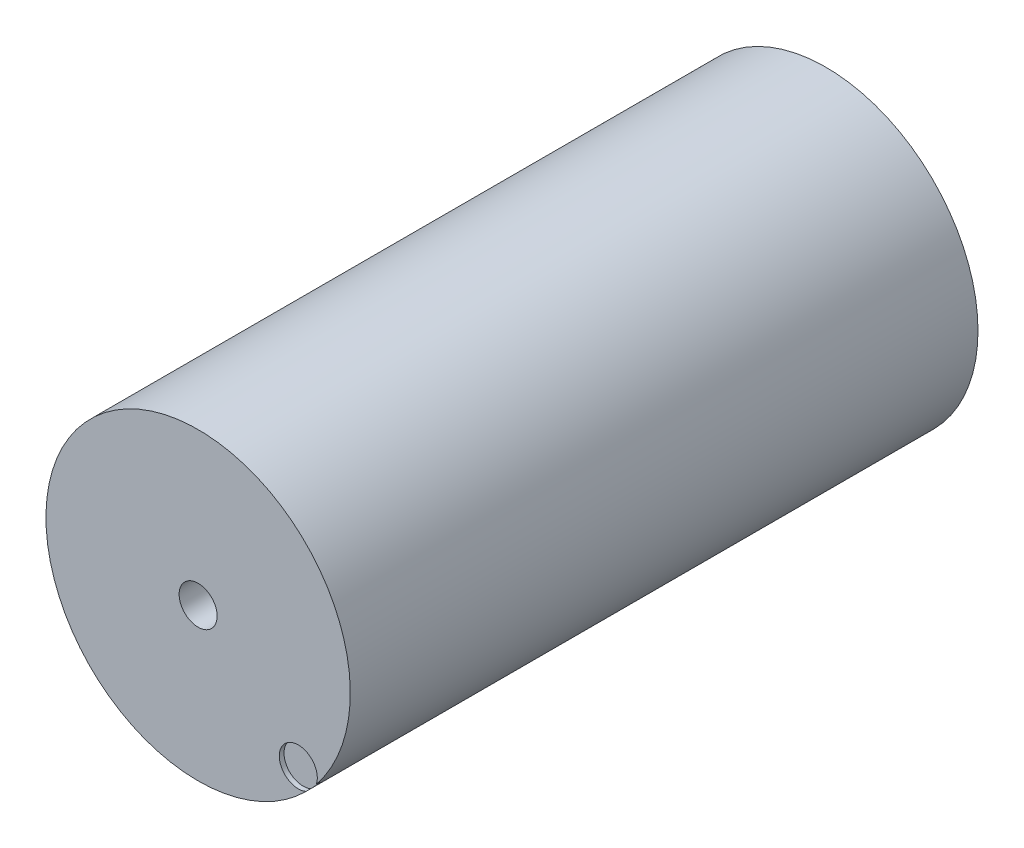
ISO-10303-21;
HEADER;
FILE_DESCRIPTION(('STEP AP214'),'2;1');
FILE_NAME('part.step','',(''),(''),'','','');
FILE_SCHEMA(('AUTOMOTIVE_DESIGN { 1 0 10303 214 1 1 1 1 }'));
ENDSEC;
DATA;
#1=APPLICATION_CONTEXT('core data for automotive mechanical design processes');
#2=APPLICATION_PROTOCOL_DEFINITION('international standard','automotive_design',2000,#1);
#3=PRODUCT_CONTEXT('',#1,'mechanical');
#4=PRODUCT('Part','Part','',(#3));
#5=PRODUCT_RELATED_PRODUCT_CATEGORY('part','',(#4));
#6=PRODUCT_DEFINITION_FORMATION('','',#4);
#7=PRODUCT_DEFINITION_CONTEXT('part definition',#1,'design');
#8=PRODUCT_DEFINITION('design','',#6,#7);
#9=PRODUCT_DEFINITION_SHAPE('','',#8);
#10=(LENGTH_UNIT() NAMED_UNIT(*) SI_UNIT(.MILLI.,.METRE.));
#11=(NAMED_UNIT(*) PLANE_ANGLE_UNIT() SI_UNIT($,.RADIAN.));
#12=(NAMED_UNIT(*) SI_UNIT($,.STERADIAN.) SOLID_ANGLE_UNIT());
#13=UNCERTAINTY_MEASURE_WITH_UNIT(LENGTH_MEASURE(1.E-05),#10,'distance_accuracy_value','');
#14=(GEOMETRIC_REPRESENTATION_CONTEXT(3) GLOBAL_UNCERTAINTY_ASSIGNED_CONTEXT((#13)) GLOBAL_UNIT_ASSIGNED_CONTEXT((#10,
#11,#12)) REPRESENTATION_CONTEXT('',''));
#15=CARTESIAN_POINT('',(0.,0.,0.));
#16=DIRECTION('',(0.,0.,1.));
#17=DIRECTION('',(1.,0.,0.));
#18=AXIS2_PLACEMENT_3D('',#15,#16,#17);
#19=CARTESIAN_POINT('',(0.,0.,0.));
#20=DIRECTION('',(0.,0.,1.));
#21=DIRECTION('',(1.,0.,0.));
#22=AXIS2_PLACEMENT_3D('',#19,#20,#21);
#23=PLANE('',#22);
#24=CARTESIAN_POINT('',(0.,0.,0.));
#25=DIRECTION('',(0.,0.,1.));
#26=DIRECTION('',(1.,0.,0.));
#27=AXIS2_PLACEMENT_3D('',#24,#25,#26);
#28=CIRCLE('',#27,1.99999999999998);
#29=CARTESIAN_POINT('',(1.99999999999998,0.,0.));
#30=VERTEX_POINT('',#29);
#31=EDGE_CURVE('E82',#30,#30,#28,.T.);
#32=ORIENTED_EDGE('',*,*,#31,.T.);
#33=EDGE_LOOP('',(#32));
#34=FACE_BOUND('',#33,.T.);
#35=CARTESIAN_POINT('',(0.,0.,0.));
#36=DIRECTION('',(0.,0.,1.));
#37=DIRECTION('',(1.,0.,0.));
#38=AXIS2_PLACEMENT_3D('',#35,#36,#37);
#39=CIRCLE('',#38,16.);
#40=CARTESIAN_POINT('',(16.,0.,0.));
#41=VERTEX_POINT('',#40);
#42=EDGE_CURVE('E91',#41,#41,#39,.T.);
#43=ORIENTED_EDGE('',*,*,#42,.F.);
#44=EDGE_LOOP('',(#43));
#45=FACE_BOUND('',#44,.T.);
#46=ADVANCED_FACE('F53',(#34,#45),#23,.F.);
#47=CARTESIAN_POINT('',(0.,0.,66.));
#48=DIRECTION('',(0.,0.,1.));
#49=DIRECTION('',(1.,0.,0.));
#50=AXIS2_PLACEMENT_3D('',#47,#48,#49);
#51=PLANE('',#50);
#52=CARTESIAN_POINT('',(0.,0.,66.));
#53=DIRECTION('',(0.,0.,1.));
#54=DIRECTION('',(1.,0.,0.));
#55=AXIS2_PLACEMENT_3D('',#52,#53,#54);
#56=CIRCLE('',#55,1.99999999999999);
#57=CARTESIAN_POINT('',(1.99999999999999,0.,66.));
#58=VERTEX_POINT('',#57);
#59=EDGE_CURVE('E206',#58,#58,#56,.T.);
#60=ORIENTED_EDGE('',*,*,#59,.F.);
#61=EDGE_LOOP('',(#60));
#62=FACE_BOUND('',#61,.T.);
#63=CARTESIAN_POINT('',(10.5321145046291,-9.45328245563246,66.));
#64=DIRECTION('',(0.,0.,1.));
#65=DIRECTION('',(1.,0.,0.));
#66=AXIS2_PLACEMENT_3D('',#63,#64,#65);
#67=CIRCLE('',#66,1.99999999999999);
#68=CARTESIAN_POINT('',(12.435338152409,-10.0678878139976,66.));
#69=VERTEX_POINT('',#68);
#70=CARTESIAN_POINT('',(11.3480272997679,-11.2792852789404,66.));
#71=VERTEX_POINT('',#70);
#72=EDGE_CURVE('E75',#69,#71,#67,.T.);
#73=ORIENTED_EDGE('',*,*,#72,.F.);
#74=CARTESIAN_POINT('',(0.,0.,66.));
#75=DIRECTION('',(0.,0.,1.));
#76=DIRECTION('',(1.,0.,0.));
#77=AXIS2_PLACEMENT_3D('',#74,#75,#76);
#78=CIRCLE('',#77,16.);
#79=EDGE_CURVE('E88',#69,#71,#78,.T.);
#80=ORIENTED_EDGE('',*,*,#79,.T.);
#81=EDGE_LOOP('',(#73,#80));
#82=FACE_BOUND('',#81,.T.);
#83=ADVANCED_FACE('F89',(#62,#82),#51,.T.);
#84=CARTESIAN_POINT('',(0.,0.,66.));
#85=DIRECTION('',(0.,0.,-1.));
#86=DIRECTION('',(-1.,0.,0.));
#87=AXIS2_PLACEMENT_3D('',#84,#85,#86);
#88=CYLINDRICAL_SURFACE('',#87,16.);
#89=DIRECTION('',(0.,0.,1.));
#90=VECTOR('',#89,1.);
#91=CARTESIAN_POINT('',(11.348027299768,-11.2792852789404,65.75));
#92=LINE('',#91,#90);
#93=CARTESIAN_POINT('',(11.348027299768,-11.2792852789404,65.5));
#94=VERTEX_POINT('',#93);
#95=EDGE_CURVE('E12',#71,#94,#92,.F.);
#96=ORIENTED_EDGE('',*,*,#95,.F.);
#97=ORIENTED_EDGE('',*,*,#79,.F.);
#98=DIRECTION('',(0.,0.,1.));
#99=VECTOR('',#98,1.);
#100=CARTESIAN_POINT('',(12.435338152409,-10.0678878139976,65.75));
#101=LINE('',#100,#99);
#102=CARTESIAN_POINT('',(12.435338152409,-10.0678878139976,65.5));
#103=VERTEX_POINT('',#102);
#104=EDGE_CURVE('E78',#103,#69,#101,.T.);
#105=ORIENTED_EDGE('',*,*,#104,.F.);
#106=CARTESIAN_POINT('',(0.,0.,65.5));
#107=DIRECTION('',(0.,0.,-1.));
#108=DIRECTION('',(-1.,0.,0.));
#109=AXIS2_PLACEMENT_3D('',#106,#107,#108);
#110=CIRCLE('',#109,16.);
#111=EDGE_CURVE('E60',#94,#103,#110,.F.);
#112=ORIENTED_EDGE('',*,*,#111,.F.);
#113=EDGE_LOOP('',(#96,#97,#105,#112));
#114=FACE_BOUND('',#113,.T.);
#115=ORIENTED_EDGE('',*,*,#42,.T.);
#116=EDGE_LOOP('',(#115));
#117=FACE_BOUND('',#116,.T.);
#118=ADVANCED_FACE('F86',(#114,#117),#88,.T.);
#119=CARTESIAN_POINT('',(10.5321145046291,-9.45328245563246,65.5));
#120=DIRECTION('',(0.,0.,-1.));
#121=DIRECTION('',(-1.,0.,0.));
#122=AXIS2_PLACEMENT_3D('',#119,#120,#121);
#123=PLANE('',#122);
#124=ORIENTED_EDGE('',*,*,#111,.T.);
#125=CARTESIAN_POINT('',(10.5321145046291,-9.45328245563246,65.5));
#126=DIRECTION('',(0.,0.,1.));
#127=DIRECTION('',(1.,0.,0.));
#128=AXIS2_PLACEMENT_3D('',#125,#126,#127);
#129=CIRCLE('',#128,1.99999999999999);
#130=EDGE_CURVE('E66',#103,#94,#129,.T.);
#131=ORIENTED_EDGE('',*,*,#130,.T.);
#132=EDGE_LOOP('',(#124,#131));
#133=FACE_BOUND('',#132,.T.);
#134=ADVANCED_FACE('F185',(#133),#123,.F.);
#135=CARTESIAN_POINT('',(10.5321145046291,-9.45328245563246,66.));
#136=DIRECTION('',(0.,0.,1.));
#137=DIRECTION('',(1.,0.,0.));
#138=AXIS2_PLACEMENT_3D('',#135,#136,#137);
#139=CYLINDRICAL_SURFACE('',#138,1.99999999999999);
#140=ORIENTED_EDGE('',*,*,#95,.T.);
#141=ORIENTED_EDGE('',*,*,#130,.F.);
#142=ORIENTED_EDGE('',*,*,#104,.T.);
#143=ORIENTED_EDGE('',*,*,#72,.T.);
#144=EDGE_LOOP('',(#140,#141,#142,#143));
#145=FACE_BOUND('',#144,.T.);
#146=ADVANCED_FACE('F76',(#145),#139,.F.);
#147=CARTESIAN_POINT('',(0.,0.,66.));
#148=DIRECTION('',(0.,0.,1.));
#149=DIRECTION('',(1.,0.,0.));
#150=AXIS2_PLACEMENT_3D('',#147,#148,#149);
#151=CYLINDRICAL_SURFACE('',#150,1.99999999999998);
#152=ORIENTED_EDGE('',*,*,#31,.F.);
#153=EDGE_LOOP('',(#152));
#154=FACE_BOUND('',#153,.T.);
#155=ORIENTED_EDGE('',*,*,#59,.T.);
#156=EDGE_LOOP('',(#155));
#157=FACE_BOUND('',#156,.T.);
#158=ADVANCED_FACE('F192',(#154,#157),#151,.F.);
#159=CLOSED_SHELL('',(#46,#83,#118,#134,#146,#158));
#160=MANIFOLD_SOLID_BREP('B2',#159);
#161=ADVANCED_BREP_SHAPE_REPRESENTATION('',(#18,#160),#14);
#162=SHAPE_DEFINITION_REPRESENTATION(#9,#161);
ENDSEC;
END-ISO-10303-21;
